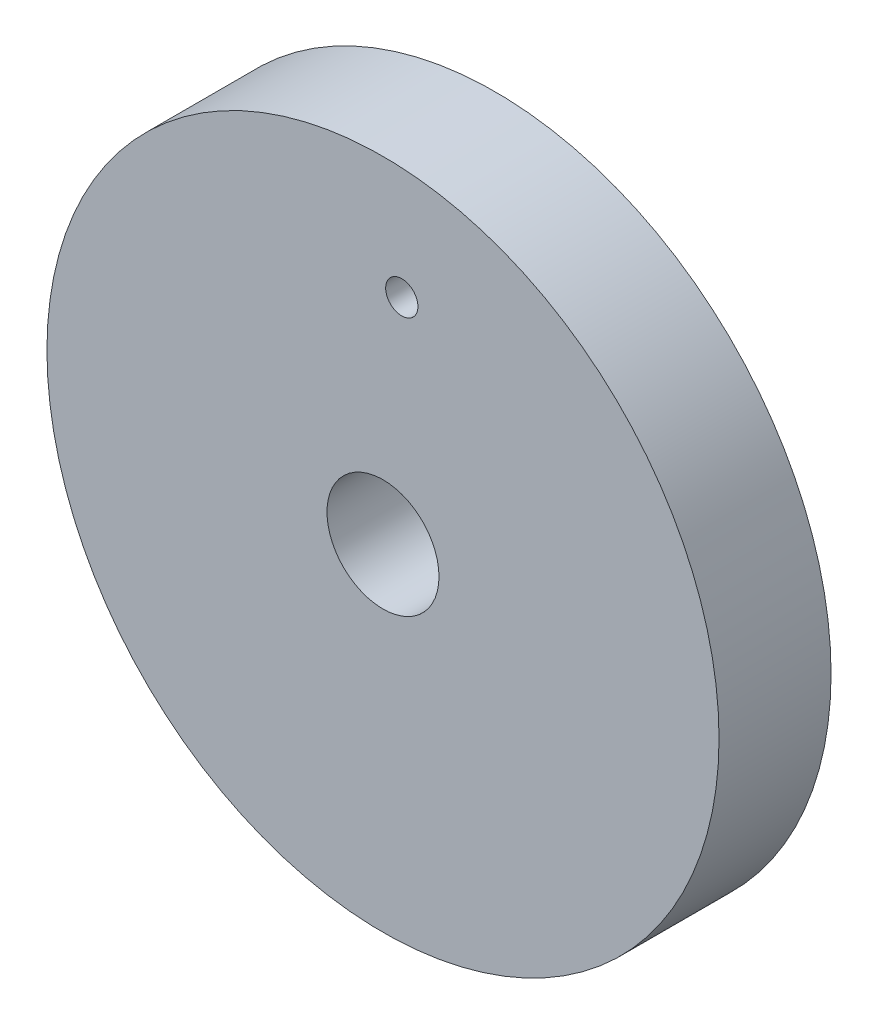
ISO-10303-21;
HEADER;
FILE_DESCRIPTION(('STEP AP214'),'2;1');
FILE_NAME('part.step','',(''),(''),'','','');
FILE_SCHEMA(('AUTOMOTIVE_DESIGN { 1 0 10303 214 1 1 1 1 }'));
ENDSEC;
DATA;
#1=APPLICATION_CONTEXT('core data for automotive mechanical design processes');
#2=APPLICATION_PROTOCOL_DEFINITION('international standard','automotive_design',2000,#1);
#3=PRODUCT_CONTEXT('',#1,'mechanical');
#4=PRODUCT('Part','Part','',(#3));
#5=PRODUCT_RELATED_PRODUCT_CATEGORY('part','',(#4));
#6=PRODUCT_DEFINITION_FORMATION('','',#4);
#7=PRODUCT_DEFINITION_CONTEXT('part definition',#1,'design');
#8=PRODUCT_DEFINITION('design','',#6,#7);
#9=PRODUCT_DEFINITION_SHAPE('','',#8);
#10=(LENGTH_UNIT() NAMED_UNIT(*) SI_UNIT(.MILLI.,.METRE.));
#11=(NAMED_UNIT(*) PLANE_ANGLE_UNIT() SI_UNIT($,.RADIAN.));
#12=(NAMED_UNIT(*) SI_UNIT($,.STERADIAN.) SOLID_ANGLE_UNIT());
#13=UNCERTAINTY_MEASURE_WITH_UNIT(LENGTH_MEASURE(1.E-05),#10,'distance_accuracy_value','');
#14=(GEOMETRIC_REPRESENTATION_CONTEXT(3) GLOBAL_UNCERTAINTY_ASSIGNED_CONTEXT((#13)) GLOBAL_UNIT_ASSIGNED_CONTEXT((#10,
#11,#12)) REPRESENTATION_CONTEXT('',''));
#15=CARTESIAN_POINT('',(0.,0.,0.));
#16=DIRECTION('',(0.,0.,1.));
#17=DIRECTION('',(1.,0.,0.));
#18=AXIS2_PLACEMENT_3D('',#15,#16,#17);
#19=CARTESIAN_POINT('',(0.,0.,12.7));
#20=DIRECTION('',(0.,0.,1.));
#21=DIRECTION('',(1.,0.,0.));
#22=AXIS2_PLACEMENT_3D('',#19,#20,#21);
#23=PLANE('',#22);
#24=CARTESIAN_POINT('',(2.13041608719777,25.3196251202326,12.7));
#25=DIRECTION('',(0.,0.,1.));
#26=DIRECTION('',(1.,0.,0.));
#27=AXIS2_PLACEMENT_3D('',#24,#25,#26);
#28=CIRCLE('',#27,1.82864262745852);
#29=CARTESIAN_POINT('',(3.95905871465629,25.3196251202326,12.7));
#30=VERTEX_POINT('',#29);
#31=EDGE_CURVE('E50',#30,#30,#28,.T.);
#32=ORIENTED_EDGE('',*,*,#31,.F.);
#33=EDGE_LOOP('',(#32));
#34=FACE_BOUND('',#33,.T.);
#35=CARTESIAN_POINT('',(0.,0.,12.7));
#36=DIRECTION('',(0.,0.,1.));
#37=DIRECTION('',(1.,0.,0.));
#38=AXIS2_PLACEMENT_3D('',#35,#36,#37);
#39=CIRCLE('',#38,38.1);
#40=CARTESIAN_POINT('',(38.1,0.,12.7));
#41=VERTEX_POINT('',#40);
#42=EDGE_CURVE('E10',#41,#41,#39,.T.);
#43=ORIENTED_EDGE('',*,*,#42,.T.);
#44=EDGE_LOOP('',(#43));
#45=FACE_BOUND('',#44,.T.);
#46=CARTESIAN_POINT('',(0.,0.,12.7));
#47=DIRECTION('',(0.,0.,1.));
#48=DIRECTION('',(1.,0.,0.));
#49=AXIS2_PLACEMENT_3D('',#46,#47,#48);
#50=CIRCLE('',#49,6.35);
#51=CARTESIAN_POINT('',(6.35,0.,12.7));
#52=VERTEX_POINT('',#51);
#53=EDGE_CURVE('E42',#52,#52,#50,.T.);
#54=ORIENTED_EDGE('',*,*,#53,.F.);
#55=EDGE_LOOP('',(#54));
#56=FACE_BOUND('',#55,.T.);
#57=ADVANCED_FACE('F31',(#34,#45,#56),#23,.T.);
#58=CARTESIAN_POINT('',(0.,0.,0.));
#59=DIRECTION('',(0.,0.,1.));
#60=DIRECTION('',(1.,0.,0.));
#61=AXIS2_PLACEMENT_3D('',#58,#59,#60);
#62=PLANE('',#61);
#63=CARTESIAN_POINT('',(2.13041608719777,25.3196251202326,0.));
#64=DIRECTION('',(0.,0.,1.));
#65=DIRECTION('',(1.,0.,0.));
#66=AXIS2_PLACEMENT_3D('',#63,#64,#65);
#67=CIRCLE('',#66,1.82864262745852);
#68=CARTESIAN_POINT('',(3.95905871465629,25.3196251202326,0.));
#69=VERTEX_POINT('',#68);
#70=EDGE_CURVE('E47',#69,#69,#67,.T.);
#71=ORIENTED_EDGE('',*,*,#70,.T.);
#72=EDGE_LOOP('',(#71));
#73=FACE_BOUND('',#72,.T.);
#74=CARTESIAN_POINT('',(0.,0.,0.));
#75=DIRECTION('',(0.,0.,1.));
#76=DIRECTION('',(1.,0.,0.));
#77=AXIS2_PLACEMENT_3D('',#74,#75,#76);
#78=CIRCLE('',#77,38.1);
#79=CARTESIAN_POINT('',(38.1,0.,0.));
#80=VERTEX_POINT('',#79);
#81=EDGE_CURVE('E35',#80,#80,#78,.T.);
#82=ORIENTED_EDGE('',*,*,#81,.F.);
#83=EDGE_LOOP('',(#82));
#84=FACE_BOUND('',#83,.T.);
#85=CARTESIAN_POINT('',(0.,0.,0.));
#86=DIRECTION('',(0.,0.,1.));
#87=DIRECTION('',(1.,0.,0.));
#88=AXIS2_PLACEMENT_3D('',#85,#86,#87);
#89=CIRCLE('',#88,6.35);
#90=CARTESIAN_POINT('',(6.35,0.,0.));
#91=VERTEX_POINT('',#90);
#92=EDGE_CURVE('E44',#91,#91,#89,.T.);
#93=ORIENTED_EDGE('',*,*,#92,.T.);
#94=EDGE_LOOP('',(#93));
#95=FACE_BOUND('',#94,.T.);
#96=ADVANCED_FACE('F56',(#73,#84,#95),#62,.F.);
#97=CARTESIAN_POINT('',(0.,0.,12.7));
#98=DIRECTION('',(0.,0.,-1.));
#99=DIRECTION('',(-1.,0.,0.));
#100=AXIS2_PLACEMENT_3D('',#97,#98,#99);
#101=CYLINDRICAL_SURFACE('',#100,38.1);
#102=ORIENTED_EDGE('',*,*,#42,.F.);
#103=EDGE_LOOP('',(#102));
#104=FACE_BOUND('',#103,.T.);
#105=ORIENTED_EDGE('',*,*,#81,.T.);
#106=EDGE_LOOP('',(#105));
#107=FACE_BOUND('',#106,.T.);
#108=ADVANCED_FACE('F33',(#104,#107),#101,.T.);
#109=CARTESIAN_POINT('',(0.,0.,12.7));
#110=DIRECTION('',(0.,0.,-1.));
#111=DIRECTION('',(-1.,0.,0.));
#112=AXIS2_PLACEMENT_3D('',#109,#110,#111);
#113=CYLINDRICAL_SURFACE('',#112,6.35);
#114=ORIENTED_EDGE('',*,*,#53,.T.);
#115=EDGE_LOOP('',(#114));
#116=FACE_BOUND('',#115,.T.);
#117=ORIENTED_EDGE('',*,*,#92,.F.);
#118=EDGE_LOOP('',(#117));
#119=FACE_BOUND('',#118,.T.);
#120=ADVANCED_FACE('F62',(#116,#119),#113,.F.);
#121=CARTESIAN_POINT('',(2.13041608719777,25.3196251202326,0.));
#122=DIRECTION('',(0.,0.,1.));
#123=DIRECTION('',(1.,0.,0.));
#124=AXIS2_PLACEMENT_3D('',#121,#122,#123);
#125=CYLINDRICAL_SURFACE('',#124,1.82864262745852);
#126=ORIENTED_EDGE('',*,*,#70,.F.);
#127=EDGE_LOOP('',(#126));
#128=FACE_BOUND('',#127,.T.);
#129=ORIENTED_EDGE('',*,*,#31,.T.);
#130=EDGE_LOOP('',(#129));
#131=FACE_BOUND('',#130,.T.);
#132=ADVANCED_FACE('F59',(#128,#131),#125,.F.);
#133=CLOSED_SHELL('',(#57,#96,#108,#120,#132));
#134=MANIFOLD_SOLID_BREP('B2',#133);
#135=ADVANCED_BREP_SHAPE_REPRESENTATION('',(#18,#134),#14);
#136=SHAPE_DEFINITION_REPRESENTATION(#9,#135);
ENDSEC;
END-ISO-10303-21;
